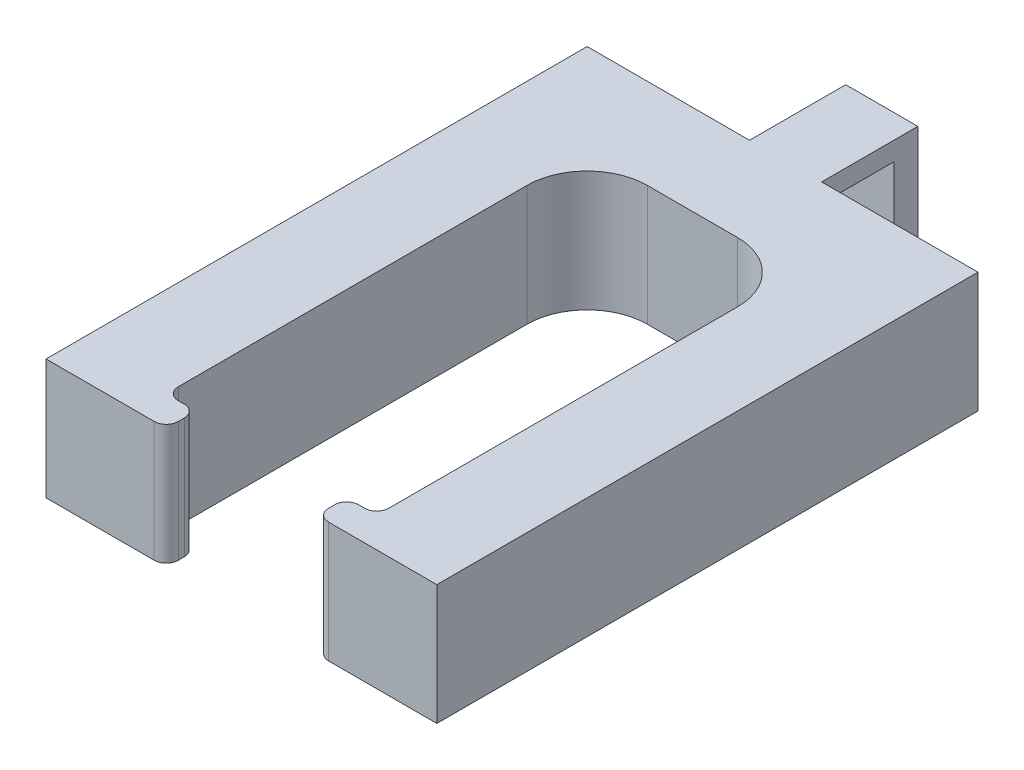
ISO-10303-21;
HEADER;
FILE_DESCRIPTION(('STEP AP214'),'2;1');
FILE_NAME('part.step','',(''),(''),'','','');
FILE_SCHEMA(('AUTOMOTIVE_DESIGN { 1 0 10303 214 1 1 1 1 }'));
ENDSEC;
DATA;
#1=APPLICATION_CONTEXT('core data for automotive mechanical design processes');
#2=APPLICATION_PROTOCOL_DEFINITION('international standard','automotive_design',2000,#1);
#3=PRODUCT_CONTEXT('',#1,'mechanical');
#4=PRODUCT('Part','Part','',(#3));
#5=PRODUCT_RELATED_PRODUCT_CATEGORY('part','',(#4));
#6=PRODUCT_DEFINITION_FORMATION('','',#4);
#7=PRODUCT_DEFINITION_CONTEXT('part definition',#1,'design');
#8=PRODUCT_DEFINITION('design','',#6,#7);
#9=PRODUCT_DEFINITION_SHAPE('','',#8);
#10=(LENGTH_UNIT() NAMED_UNIT(*) SI_UNIT(.MILLI.,.METRE.));
#11=(NAMED_UNIT(*) PLANE_ANGLE_UNIT() SI_UNIT($,.RADIAN.));
#12=(NAMED_UNIT(*) SI_UNIT($,.STERADIAN.) SOLID_ANGLE_UNIT());
#13=UNCERTAINTY_MEASURE_WITH_UNIT(LENGTH_MEASURE(1.E-05),#10,'distance_accuracy_value','');
#14=(GEOMETRIC_REPRESENTATION_CONTEXT(3) GLOBAL_UNCERTAINTY_ASSIGNED_CONTEXT((#13)) GLOBAL_UNIT_ASSIGNED_CONTEXT((#10,
#11,#12)) REPRESENTATION_CONTEXT('',''));
#15=CARTESIAN_POINT('',(0.,0.,0.));
#16=DIRECTION('',(0.,0.,1.));
#17=DIRECTION('',(1.,0.,0.));
#18=AXIS2_PLACEMENT_3D('',#15,#16,#17);
#19=CARTESIAN_POINT('',(0.,20.,0.));
#20=DIRECTION('',(0.,0.,-1.));
#21=DIRECTION('',(-1.,0.,0.));
#22=AXIS2_PLACEMENT_3D('',#19,#20,#21);
#23=PLANE('',#22);
#24=DIRECTION('',(1.,0.,0.));
#25=VECTOR('',#24,1.);
#26=CARTESIAN_POINT('',(0.,0.,0.));
#27=LINE('',#26,#25);
#28=CARTESIAN_POINT('',(0.,0.,0.));
#29=VERTEX_POINT('',#28);
#30=CARTESIAN_POINT('',(18.,0.,0.));
#31=VERTEX_POINT('',#30);
#32=EDGE_CURVE('E220',#29,#31,#27,.T.);
#33=ORIENTED_EDGE('',*,*,#32,.T.);
#34=DIRECTION('',(0.,-1.,0.));
#35=VECTOR('',#34,1.);
#36=CARTESIAN_POINT('',(18.,20.,0.));
#37=LINE('',#36,#35);
#38=CARTESIAN_POINT('',(18.,20.,0.));
#39=VERTEX_POINT('',#38);
#40=EDGE_CURVE('E308',#39,#31,#37,.T.);
#41=ORIENTED_EDGE('',*,*,#40,.F.);
#42=DIRECTION('',(1.,0.,0.));
#43=VECTOR('',#42,1.);
#44=CARTESIAN_POINT('',(0.,20.,0.));
#45=LINE('',#44,#43);
#46=CARTESIAN_POINT('',(0.,20.,0.));
#47=VERTEX_POINT('',#46);
#48=EDGE_CURVE('E260',#47,#39,#45,.T.);
#49=ORIENTED_EDGE('',*,*,#48,.F.);
#50=DIRECTION('',(0.,-1.,0.));
#51=VECTOR('',#50,1.);
#52=CARTESIAN_POINT('',(0.,20.,0.));
#53=LINE('',#52,#51);
#54=EDGE_CURVE('E219',#47,#29,#53,.T.);
#55=ORIENTED_EDGE('',*,*,#54,.T.);
#56=EDGE_LOOP('',(#33,#41,#49,#55));
#57=FACE_BOUND('',#56,.T.);
#58=ADVANCED_FACE('F35',(#57),#23,.F.);
#59=CARTESIAN_POINT('',(18.,20.,-2.));
#60=DIRECTION('',(0.,-1.,0.));
#61=DIRECTION('',(0.,0.,-1.));
#62=AXIS2_PLACEMENT_3D('',#59,#60,#61);
#63=CYLINDRICAL_SURFACE('',#62,2.);
#64=CARTESIAN_POINT('',(18.,0.,-2.));
#65=DIRECTION('',(0.,1.,0.));
#66=DIRECTION('',(0.,0.,1.));
#67=AXIS2_PLACEMENT_3D('',#64,#65,#66);
#68=CIRCLE('',#67,2.);
#69=CARTESIAN_POINT('',(20.,0.,-2.00000000000001));
#70=VERTEX_POINT('',#69);
#71=EDGE_CURVE('E223',#31,#70,#68,.T.);
#72=ORIENTED_EDGE('',*,*,#71,.T.);
#73=DIRECTION('',(0.,-1.,0.));
#74=VECTOR('',#73,1.);
#75=CARTESIAN_POINT('',(20.,20.,-2.00000000000001));
#76=LINE('',#75,#74);
#77=CARTESIAN_POINT('',(20.,20.,-2.00000000000001));
#78=VERTEX_POINT('',#77);
#79=EDGE_CURVE('E305',#78,#70,#76,.T.);
#80=ORIENTED_EDGE('',*,*,#79,.F.);
#81=CARTESIAN_POINT('',(18.,20.,-2.));
#82=DIRECTION('',(0.,1.,0.));
#83=DIRECTION('',(0.,0.,1.));
#84=AXIS2_PLACEMENT_3D('',#81,#82,#83);
#85=CIRCLE('',#84,2.);
#86=EDGE_CURVE('E136',#39,#78,#85,.T.);
#87=ORIENTED_EDGE('',*,*,#86,.F.);
#88=ORIENTED_EDGE('',*,*,#40,.T.);
#89=EDGE_LOOP('',(#72,#80,#87,#88));
#90=FACE_BOUND('',#89,.T.);
#91=ADVANCED_FACE('F392',(#90),#63,.T.);
#92=CARTESIAN_POINT('',(20.,20.,-2.00000000000001));
#93=DIRECTION('',(-1.,0.,0.));
#94=DIRECTION('',(0.,0.,1.));
#95=AXIS2_PLACEMENT_3D('',#92,#93,#94);
#96=PLANE('',#95);
#97=DIRECTION('',(0.,0.,-1.));
#98=VECTOR('',#97,1.);
#99=CARTESIAN_POINT('',(20.,0.,-2.00000000000001));
#100=LINE('',#99,#98);
#101=CARTESIAN_POINT('',(20.,0.,-2.99999999999999));
#102=VERTEX_POINT('',#101);
#103=EDGE_CURVE('E226',#70,#102,#100,.T.);
#104=ORIENTED_EDGE('',*,*,#103,.T.);
#105=DIRECTION('',(0.,-1.,0.));
#106=VECTOR('',#105,1.);
#107=CARTESIAN_POINT('',(20.,20.,-2.99999999999999));
#108=LINE('',#107,#106);
#109=CARTESIAN_POINT('',(20.,20.,-2.99999999999999));
#110=VERTEX_POINT('',#109);
#111=EDGE_CURVE('E302',#110,#102,#108,.T.);
#112=ORIENTED_EDGE('',*,*,#111,.F.);
#113=DIRECTION('',(0.,0.,-1.));
#114=VECTOR('',#113,1.);
#115=CARTESIAN_POINT('',(20.,20.,-2.00000000000001));
#116=LINE('',#115,#114);
#117=EDGE_CURVE('E343',#78,#110,#116,.T.);
#118=ORIENTED_EDGE('',*,*,#117,.F.);
#119=ORIENTED_EDGE('',*,*,#79,.T.);
#120=EDGE_LOOP('',(#104,#112,#118,#119));
#121=FACE_BOUND('',#120,.T.);
#122=ADVANCED_FACE('F395',(#121),#96,.F.);
#123=CARTESIAN_POINT('',(18.,20.,-3.));
#124=DIRECTION('',(0.,-1.,0.));
#125=DIRECTION('',(0.,0.,-1.));
#126=AXIS2_PLACEMENT_3D('',#123,#124,#125);
#127=CYLINDRICAL_SURFACE('',#126,2.);
#128=CARTESIAN_POINT('',(18.,0.,-3.));
#129=DIRECTION('',(0.,1.,0.));
#130=DIRECTION('',(0.,0.,1.));
#131=AXIS2_PLACEMENT_3D('',#128,#129,#130);
#132=CIRCLE('',#131,2.);
#133=CARTESIAN_POINT('',(18.,0.,-5.));
#134=VERTEX_POINT('',#133);
#135=EDGE_CURVE('E228',#102,#134,#132,.T.);
#136=ORIENTED_EDGE('',*,*,#135,.T.);
#137=DIRECTION('',(0.,-1.,0.));
#138=VECTOR('',#137,1.);
#139=CARTESIAN_POINT('',(18.,20.,-5.));
#140=LINE('',#139,#138);
#141=CARTESIAN_POINT('',(18.,20.,-5.));
#142=VERTEX_POINT('',#141);
#143=EDGE_CURVE('E299',#142,#134,#140,.T.);
#144=ORIENTED_EDGE('',*,*,#143,.F.);
#145=CARTESIAN_POINT('',(18.,20.,-3.));
#146=DIRECTION('',(0.,1.,0.));
#147=DIRECTION('',(0.,0.,1.));
#148=AXIS2_PLACEMENT_3D('',#145,#146,#147);
#149=CIRCLE('',#148,2.);
#150=EDGE_CURVE('E345',#110,#142,#149,.T.);
#151=ORIENTED_EDGE('',*,*,#150,.F.);
#152=ORIENTED_EDGE('',*,*,#111,.T.);
#153=EDGE_LOOP('',(#136,#144,#151,#152));
#154=FACE_BOUND('',#153,.T.);
#155=ADVANCED_FACE('F400',(#154),#127,.T.);
#156=CARTESIAN_POINT('',(18.,20.,-5.));
#157=DIRECTION('',(0.,0.,1.));
#158=DIRECTION('',(1.,0.,0.));
#159=AXIS2_PLACEMENT_3D('',#156,#157,#158);
#160=PLANE('',#159);
#161=DIRECTION('',(-1.,0.,0.));
#162=VECTOR('',#161,1.);
#163=CARTESIAN_POINT('',(18.,0.,-5.));
#164=LINE('',#163,#162);
#165=CARTESIAN_POINT('',(17.,0.,-5.));
#166=VERTEX_POINT('',#165);
#167=EDGE_CURVE('E230',#134,#166,#164,.T.);
#168=ORIENTED_EDGE('',*,*,#167,.T.);
#169=DIRECTION('',(0.,-1.,0.));
#170=VECTOR('',#169,1.);
#171=CARTESIAN_POINT('',(17.,20.,-5.));
#172=LINE('',#171,#170);
#173=CARTESIAN_POINT('',(17.,20.,-5.));
#174=VERTEX_POINT('',#173);
#175=EDGE_CURVE('E296',#174,#166,#172,.T.);
#176=ORIENTED_EDGE('',*,*,#175,.F.);
#177=DIRECTION('',(-1.,0.,0.));
#178=VECTOR('',#177,1.);
#179=CARTESIAN_POINT('',(18.,20.,-5.));
#180=LINE('',#179,#178);
#181=EDGE_CURVE('E347',#142,#174,#180,.T.);
#182=ORIENTED_EDGE('',*,*,#181,.F.);
#183=ORIENTED_EDGE('',*,*,#143,.T.);
#184=EDGE_LOOP('',(#168,#176,#182,#183));
#185=FACE_BOUND('',#184,.T.);
#186=ADVANCED_FACE('F406',(#185),#160,.F.);
#187=CARTESIAN_POINT('',(17.,20.,-7.));
#188=DIRECTION('',(0.,-1.,0.));
#189=DIRECTION('',(0.,0.,-1.));
#190=AXIS2_PLACEMENT_3D('',#187,#188,#189);
#191=CYLINDRICAL_SURFACE('',#190,2.);
#192=CARTESIAN_POINT('',(17.,0.,-7.));
#193=DIRECTION('',(0.,-1.,0.));
#194=DIRECTION('',(0.,0.,-1.));
#195=AXIS2_PLACEMENT_3D('',#192,#193,#194);
#196=CIRCLE('',#195,2.);
#197=CARTESIAN_POINT('',(15.,0.,-7.00000000000001));
#198=VERTEX_POINT('',#197);
#199=EDGE_CURVE('E232',#166,#198,#196,.T.);
#200=ORIENTED_EDGE('',*,*,#199,.T.);
#201=DIRECTION('',(0.,-1.,0.));
#202=VECTOR('',#201,1.);
#203=CARTESIAN_POINT('',(15.,20.,-7.00000000000001));
#204=LINE('',#203,#202);
#205=CARTESIAN_POINT('',(15.,20.,-7.00000000000001));
#206=VERTEX_POINT('',#205);
#207=EDGE_CURVE('E293',#206,#198,#204,.T.);
#208=ORIENTED_EDGE('',*,*,#207,.F.);
#209=CARTESIAN_POINT('',(17.,20.,-7.));
#210=DIRECTION('',(0.,-1.,0.));
#211=DIRECTION('',(0.,0.,-1.));
#212=AXIS2_PLACEMENT_3D('',#209,#210,#211);
#213=CIRCLE('',#212,2.);
#214=EDGE_CURVE('E349',#174,#206,#213,.T.);
#215=ORIENTED_EDGE('',*,*,#214,.F.);
#216=ORIENTED_EDGE('',*,*,#175,.T.);
#217=EDGE_LOOP('',(#200,#208,#215,#216));
#218=FACE_BOUND('',#217,.T.);
#219=ADVANCED_FACE('F410',(#218),#191,.F.);
#220=CARTESIAN_POINT('',(15.,20.,-7.00000000000001));
#221=DIRECTION('',(-1.,0.,0.));
#222=DIRECTION('',(0.,0.,1.));
#223=AXIS2_PLACEMENT_3D('',#220,#221,#222);
#224=PLANE('',#223);
#225=DIRECTION('',(0.,0.,-1.));
#226=VECTOR('',#225,1.);
#227=CARTESIAN_POINT('',(15.,0.,-7.00000000000001));
#228=LINE('',#227,#226);
#229=CARTESIAN_POINT('',(15.,0.,-64.9999999999999));
#230=VERTEX_POINT('',#229);
#231=EDGE_CURVE('E234',#198,#230,#228,.T.);
#232=ORIENTED_EDGE('',*,*,#231,.T.);
#233=DIRECTION('',(0.,-1.,0.));
#234=VECTOR('',#233,1.);
#235=CARTESIAN_POINT('',(15.,20.,-64.9999999999999));
#236=LINE('',#235,#234);
#237=CARTESIAN_POINT('',(15.,20.,-64.9999999999999));
#238=VERTEX_POINT('',#237);
#239=EDGE_CURVE('E290',#238,#230,#236,.T.);
#240=ORIENTED_EDGE('',*,*,#239,.F.);
#241=DIRECTION('',(0.,0.,-1.));
#242=VECTOR('',#241,1.);
#243=CARTESIAN_POINT('',(15.,20.,-7.00000000000001));
#244=LINE('',#243,#242);
#245=EDGE_CURVE('E351',#206,#238,#244,.T.);
#246=ORIENTED_EDGE('',*,*,#245,.F.);
#247=ORIENTED_EDGE('',*,*,#207,.T.);
#248=EDGE_LOOP('',(#232,#240,#246,#247));
#249=FACE_BOUND('',#248,.T.);
#250=ADVANCED_FACE('F415',(#249),#224,.F.);
#251=CARTESIAN_POINT('',(25.,20.,-65.));
#252=DIRECTION('',(0.,-1.,0.));
#253=DIRECTION('',(0.,0.,-1.));
#254=AXIS2_PLACEMENT_3D('',#251,#252,#253);
#255=CYLINDRICAL_SURFACE('',#254,10.);
#256=CARTESIAN_POINT('',(25.,0.,-65.));
#257=DIRECTION('',(0.,-1.,0.));
#258=DIRECTION('',(0.,0.,-1.));
#259=AXIS2_PLACEMENT_3D('',#256,#257,#258);
#260=CIRCLE('',#259,10.);
#261=CARTESIAN_POINT('',(25.0000000000001,0.,-75.));
#262=VERTEX_POINT('',#261);
#263=EDGE_CURVE('E236',#230,#262,#260,.T.);
#264=ORIENTED_EDGE('',*,*,#263,.T.);
#265=DIRECTION('',(0.,-1.,0.));
#266=VECTOR('',#265,1.);
#267=CARTESIAN_POINT('',(25.0000000000001,20.,-75.));
#268=LINE('',#267,#266);
#269=CARTESIAN_POINT('',(25.0000000000001,20.,-75.));
#270=VERTEX_POINT('',#269);
#271=EDGE_CURVE('E287',#270,#262,#268,.T.);
#272=ORIENTED_EDGE('',*,*,#271,.F.);
#273=CARTESIAN_POINT('',(25.,20.,-65.));
#274=DIRECTION('',(0.,-1.,0.));
#275=DIRECTION('',(0.,0.,-1.));
#276=AXIS2_PLACEMENT_3D('',#273,#274,#275);
#277=CIRCLE('',#276,10.);
#278=EDGE_CURVE('E353',#238,#270,#277,.T.);
#279=ORIENTED_EDGE('',*,*,#278,.F.);
#280=ORIENTED_EDGE('',*,*,#239,.T.);
#281=EDGE_LOOP('',(#264,#272,#279,#280));
#282=FACE_BOUND('',#281,.T.);
#283=ADVANCED_FACE('F421',(#282),#255,.F.);
#284=CARTESIAN_POINT('',(25.0000000000001,20.,-75.));
#285=DIRECTION('',(0.,0.,-1.));
#286=DIRECTION('',(-1.,0.,0.));
#287=AXIS2_PLACEMENT_3D('',#284,#285,#286);
#288=PLANE('',#287);
#289=DIRECTION('',(1.,0.,0.));
#290=VECTOR('',#289,1.);
#291=CARTESIAN_POINT('',(25.0000000000001,0.,-75.));
#292=LINE('',#291,#290);
#293=CARTESIAN_POINT('',(39.9999999999999,0.,-75.));
#294=VERTEX_POINT('',#293);
#295=EDGE_CURVE('E238',#262,#294,#292,.T.);
#296=ORIENTED_EDGE('',*,*,#295,.T.);
#297=DIRECTION('',(0.,-1.,0.));
#298=VECTOR('',#297,1.);
#299=CARTESIAN_POINT('',(39.9999999999999,20.,-75.));
#300=LINE('',#299,#298);
#301=CARTESIAN_POINT('',(39.9999999999999,20.,-75.));
#302=VERTEX_POINT('',#301);
#303=EDGE_CURVE('E284',#302,#294,#300,.T.);
#304=ORIENTED_EDGE('',*,*,#303,.F.);
#305=DIRECTION('',(1.,0.,0.));
#306=VECTOR('',#305,1.);
#307=CARTESIAN_POINT('',(25.0000000000001,20.,-75.));
#308=LINE('',#307,#306);
#309=EDGE_CURVE('E355',#270,#302,#308,.T.);
#310=ORIENTED_EDGE('',*,*,#309,.F.);
#311=ORIENTED_EDGE('',*,*,#271,.T.);
#312=EDGE_LOOP('',(#296,#304,#310,#311));
#313=FACE_BOUND('',#312,.T.);
#314=ADVANCED_FACE('F425',(#313),#288,.F.);
#315=CARTESIAN_POINT('',(40.,20.,-65.));
#316=DIRECTION('',(0.,-1.,0.));
#317=DIRECTION('',(0.,0.,-1.));
#318=AXIS2_PLACEMENT_3D('',#315,#316,#317);
#319=CYLINDRICAL_SURFACE('',#318,9.99999999999999);
#320=CARTESIAN_POINT('',(40.,0.,-65.));
#321=DIRECTION('',(0.,-1.,0.));
#322=DIRECTION('',(0.,0.,-1.));
#323=AXIS2_PLACEMENT_3D('',#320,#321,#322);
#324=CIRCLE('',#323,9.99999999999999);
#325=CARTESIAN_POINT('',(50.,0.,-64.9999999999999));
#326=VERTEX_POINT('',#325);
#327=EDGE_CURVE('E240',#294,#326,#324,.T.);
#328=ORIENTED_EDGE('',*,*,#327,.T.);
#329=DIRECTION('',(0.,-1.,0.));
#330=VECTOR('',#329,1.);
#331=CARTESIAN_POINT('',(50.,20.,-64.9999999999999));
#332=LINE('',#331,#330);
#333=CARTESIAN_POINT('',(50.,20.,-64.9999999999999));
#334=VERTEX_POINT('',#333);
#335=EDGE_CURVE('E281',#334,#326,#332,.T.);
#336=ORIENTED_EDGE('',*,*,#335,.F.);
#337=CARTESIAN_POINT('',(40.,20.,-65.));
#338=DIRECTION('',(0.,-1.,0.));
#339=DIRECTION('',(0.,0.,-1.));
#340=AXIS2_PLACEMENT_3D('',#337,#338,#339);
#341=CIRCLE('',#340,9.99999999999999);
#342=EDGE_CURVE('E357',#302,#334,#341,.T.);
#343=ORIENTED_EDGE('',*,*,#342,.F.);
#344=ORIENTED_EDGE('',*,*,#303,.T.);
#345=EDGE_LOOP('',(#328,#336,#343,#344));
#346=FACE_BOUND('',#345,.T.);
#347=ADVANCED_FACE('F430',(#346),#319,.F.);
#348=CARTESIAN_POINT('',(50.,20.,-64.9999999999999));
#349=DIRECTION('',(1.,0.,0.));
#350=DIRECTION('',(0.,0.,-1.));
#351=AXIS2_PLACEMENT_3D('',#348,#349,#350);
#352=PLANE('',#351);
#353=DIRECTION('',(0.,0.,1.));
#354=VECTOR('',#353,1.);
#355=CARTESIAN_POINT('',(50.,0.,-64.9999999999999));
#356=LINE('',#355,#354);
#357=CARTESIAN_POINT('',(50.,0.,-7.00000000000002));
#358=VERTEX_POINT('',#357);
#359=EDGE_CURVE('E242',#326,#358,#356,.T.);
#360=ORIENTED_EDGE('',*,*,#359,.T.);
#361=DIRECTION('',(0.,-1.,0.));
#362=VECTOR('',#361,1.);
#363=CARTESIAN_POINT('',(50.,20.,-7.00000000000002));
#364=LINE('',#363,#362);
#365=CARTESIAN_POINT('',(50.,20.,-7.00000000000002));
#366=VERTEX_POINT('',#365);
#367=EDGE_CURVE('E278',#366,#358,#364,.T.);
#368=ORIENTED_EDGE('',*,*,#367,.F.);
#369=DIRECTION('',(0.,0.,1.));
#370=VECTOR('',#369,1.);
#371=CARTESIAN_POINT('',(50.,20.,-64.9999999999999));
#372=LINE('',#371,#370);
#373=EDGE_CURVE('E359',#334,#366,#372,.T.);
#374=ORIENTED_EDGE('',*,*,#373,.F.);
#375=ORIENTED_EDGE('',*,*,#335,.T.);
#376=EDGE_LOOP('',(#360,#368,#374,#375));
#377=FACE_BOUND('',#376,.T.);
#378=ADVANCED_FACE('F436',(#377),#352,.F.);
#379=CARTESIAN_POINT('',(48.,20.,-7.));
#380=DIRECTION('',(0.,-1.,0.));
#381=DIRECTION('',(0.,0.,-1.));
#382=AXIS2_PLACEMENT_3D('',#379,#380,#381);
#383=CYLINDRICAL_SURFACE('',#382,2.);
#384=CARTESIAN_POINT('',(48.,0.,-7.));
#385=DIRECTION('',(0.,-1.,0.));
#386=DIRECTION('',(0.,0.,-1.));
#387=AXIS2_PLACEMENT_3D('',#384,#385,#386);
#388=CIRCLE('',#387,2.);
#389=CARTESIAN_POINT('',(48.,0.,-5.));
#390=VERTEX_POINT('',#389);
#391=EDGE_CURVE('E244',#358,#390,#388,.T.);
#392=ORIENTED_EDGE('',*,*,#391,.T.);
#393=DIRECTION('',(0.,-1.,0.));
#394=VECTOR('',#393,1.);
#395=CARTESIAN_POINT('',(48.,20.,-5.));
#396=LINE('',#395,#394);
#397=CARTESIAN_POINT('',(48.,20.,-5.));
#398=VERTEX_POINT('',#397);
#399=EDGE_CURVE('E275',#398,#390,#396,.T.);
#400=ORIENTED_EDGE('',*,*,#399,.F.);
#401=CARTESIAN_POINT('',(48.,20.,-7.));
#402=DIRECTION('',(0.,-1.,0.));
#403=DIRECTION('',(0.,0.,-1.));
#404=AXIS2_PLACEMENT_3D('',#401,#402,#403);
#405=CIRCLE('',#404,2.);
#406=EDGE_CURVE('E361',#366,#398,#405,.T.);
#407=ORIENTED_EDGE('',*,*,#406,.F.);
#408=ORIENTED_EDGE('',*,*,#367,.T.);
#409=EDGE_LOOP('',(#392,#400,#407,#408));
#410=FACE_BOUND('',#409,.T.);
#411=ADVANCED_FACE('F440',(#410),#383,.F.);
#412=CARTESIAN_POINT('',(48.,20.,-5.));
#413=DIRECTION('',(0.,0.,1.));
#414=DIRECTION('',(1.,0.,0.));
#415=AXIS2_PLACEMENT_3D('',#412,#413,#414);
#416=PLANE('',#415);
#417=DIRECTION('',(-1.,0.,0.));
#418=VECTOR('',#417,1.);
#419=CARTESIAN_POINT('',(48.,0.,-5.));
#420=LINE('',#419,#418);
#421=CARTESIAN_POINT('',(47.,0.,-5.));
#422=VERTEX_POINT('',#421);
#423=EDGE_CURVE('E246',#390,#422,#420,.T.);
#424=ORIENTED_EDGE('',*,*,#423,.T.);
#425=DIRECTION('',(0.,-1.,0.));
#426=VECTOR('',#425,1.);
#427=CARTESIAN_POINT('',(47.,20.,-5.));
#428=LINE('',#427,#426);
#429=CARTESIAN_POINT('',(47.,20.,-5.));
#430=VERTEX_POINT('',#429);
#431=EDGE_CURVE('E272',#430,#422,#428,.T.);
#432=ORIENTED_EDGE('',*,*,#431,.F.);
#433=DIRECTION('',(-1.,0.,0.));
#434=VECTOR('',#433,1.);
#435=CARTESIAN_POINT('',(48.,20.,-5.));
#436=LINE('',#435,#434);
#437=EDGE_CURVE('E363',#398,#430,#436,.T.);
#438=ORIENTED_EDGE('',*,*,#437,.F.);
#439=ORIENTED_EDGE('',*,*,#399,.T.);
#440=EDGE_LOOP('',(#424,#432,#438,#439));
#441=FACE_BOUND('',#440,.T.);
#442=ADVANCED_FACE('F445',(#441),#416,.F.);
#443=CARTESIAN_POINT('',(47.,20.,-3.));
#444=DIRECTION('',(0.,-1.,0.));
#445=DIRECTION('',(0.,0.,-1.));
#446=AXIS2_PLACEMENT_3D('',#443,#444,#445);
#447=CYLINDRICAL_SURFACE('',#446,2.);
#448=CARTESIAN_POINT('',(47.,0.,-3.));
#449=DIRECTION('',(0.,1.,0.));
#450=DIRECTION('',(0.,0.,1.));
#451=AXIS2_PLACEMENT_3D('',#448,#449,#450);
#452=CIRCLE('',#451,2.);
#453=CARTESIAN_POINT('',(45.,0.,-2.99999999999999));
#454=VERTEX_POINT('',#453);
#455=EDGE_CURVE('E248',#422,#454,#452,.T.);
#456=ORIENTED_EDGE('',*,*,#455,.T.);
#457=DIRECTION('',(0.,-1.,0.));
#458=VECTOR('',#457,1.);
#459=CARTESIAN_POINT('',(45.,20.,-2.99999999999999));
#460=LINE('',#459,#458);
#461=CARTESIAN_POINT('',(45.,20.,-2.99999999999999));
#462=VERTEX_POINT('',#461);
#463=EDGE_CURVE('E269',#462,#454,#460,.T.);
#464=ORIENTED_EDGE('',*,*,#463,.F.);
#465=CARTESIAN_POINT('',(47.,20.,-3.));
#466=DIRECTION('',(0.,1.,0.));
#467=DIRECTION('',(0.,0.,1.));
#468=AXIS2_PLACEMENT_3D('',#465,#466,#467);
#469=CIRCLE('',#468,2.);
#470=EDGE_CURVE('E365',#430,#462,#469,.T.);
#471=ORIENTED_EDGE('',*,*,#470,.F.);
#472=ORIENTED_EDGE('',*,*,#431,.T.);
#473=EDGE_LOOP('',(#456,#464,#471,#472));
#474=FACE_BOUND('',#473,.T.);
#475=ADVANCED_FACE('F448',(#474),#447,.T.);
#476=CARTESIAN_POINT('',(45.,20.,-2.99999999999999));
#477=DIRECTION('',(1.,0.,0.));
#478=DIRECTION('',(0.,0.,-1.));
#479=AXIS2_PLACEMENT_3D('',#476,#477,#478);
#480=PLANE('',#479);
#481=DIRECTION('',(0.,0.,1.));
#482=VECTOR('',#481,1.);
#483=CARTESIAN_POINT('',(45.,0.,-2.99999999999999));
#484=LINE('',#483,#482);
#485=CARTESIAN_POINT('',(45.,0.,-2.00000000000001));
#486=VERTEX_POINT('',#485);
#487=EDGE_CURVE('E250',#454,#486,#484,.T.);
#488=ORIENTED_EDGE('',*,*,#487,.T.);
#489=DIRECTION('',(0.,-1.,0.));
#490=VECTOR('',#489,1.);
#491=CARTESIAN_POINT('',(45.,20.,-2.00000000000001));
#492=LINE('',#491,#490);
#493=CARTESIAN_POINT('',(45.,20.,-2.00000000000001));
#494=VERTEX_POINT('',#493);
#495=EDGE_CURVE('E266',#494,#486,#492,.T.);
#496=ORIENTED_EDGE('',*,*,#495,.F.);
#497=DIRECTION('',(0.,0.,1.));
#498=VECTOR('',#497,1.);
#499=CARTESIAN_POINT('',(45.,20.,-2.99999999999999));
#500=LINE('',#499,#498);
#501=EDGE_CURVE('E367',#462,#494,#500,.T.);
#502=ORIENTED_EDGE('',*,*,#501,.F.);
#503=ORIENTED_EDGE('',*,*,#463,.T.);
#504=EDGE_LOOP('',(#488,#496,#502,#503));
#505=FACE_BOUND('',#504,.T.);
#506=ADVANCED_FACE('F373',(#505),#480,.F.);
#507=CARTESIAN_POINT('',(47.,20.,-2.));
#508=DIRECTION('',(0.,-1.,0.));
#509=DIRECTION('',(0.,0.,-1.));
#510=AXIS2_PLACEMENT_3D('',#507,#508,#509);
#511=CYLINDRICAL_SURFACE('',#510,2.);
#512=CARTESIAN_POINT('',(47.,0.,-2.));
#513=DIRECTION('',(0.,1.,0.));
#514=DIRECTION('',(0.,0.,1.));
#515=AXIS2_PLACEMENT_3D('',#512,#513,#514);
#516=CIRCLE('',#515,2.);
#517=CARTESIAN_POINT('',(47.,0.,0.));
#518=VERTEX_POINT('',#517);
#519=EDGE_CURVE('E252',#486,#518,#516,.T.);
#520=ORIENTED_EDGE('',*,*,#519,.T.);
#521=DIRECTION('',(0.,-1.,0.));
#522=VECTOR('',#521,1.);
#523=CARTESIAN_POINT('',(47.,20.,0.));
#524=LINE('',#523,#522);
#525=CARTESIAN_POINT('',(47.,20.,0.));
#526=VERTEX_POINT('',#525);
#527=EDGE_CURVE('E207',#526,#518,#524,.T.);
#528=ORIENTED_EDGE('',*,*,#527,.F.);
#529=CARTESIAN_POINT('',(47.,20.,-2.));
#530=DIRECTION('',(0.,1.,0.));
#531=DIRECTION('',(0.,0.,1.));
#532=AXIS2_PLACEMENT_3D('',#529,#530,#531);
#533=CIRCLE('',#532,2.);
#534=EDGE_CURVE('E194',#494,#526,#533,.T.);
#535=ORIENTED_EDGE('',*,*,#534,.F.);
#536=ORIENTED_EDGE('',*,*,#495,.T.);
#537=EDGE_LOOP('',(#520,#528,#535,#536));
#538=FACE_BOUND('',#537,.T.);
#539=ADVANCED_FACE('F377',(#538),#511,.T.);
#540=CARTESIAN_POINT('',(47.,20.,0.));
#541=DIRECTION('',(0.,0.,-1.));
#542=DIRECTION('',(-1.,0.,0.));
#543=AXIS2_PLACEMENT_3D('',#540,#541,#542);
#544=PLANE('',#543);
#545=DIRECTION('',(1.,0.,0.));
#546=VECTOR('',#545,1.);
#547=CARTESIAN_POINT('',(47.,0.,0.));
#548=LINE('',#547,#546);
#549=CARTESIAN_POINT('',(65.,0.,0.));
#550=VERTEX_POINT('',#549);
#551=EDGE_CURVE('E203',#518,#550,#548,.T.);
#552=ORIENTED_EDGE('',*,*,#551,.T.);
#553=DIRECTION('',(0.,-1.,0.));
#554=VECTOR('',#553,1.);
#555=CARTESIAN_POINT('',(65.,20.,0.));
#556=LINE('',#555,#554);
#557=CARTESIAN_POINT('',(65.,20.,0.));
#558=VERTEX_POINT('',#557);
#559=EDGE_CURVE('E200',#558,#550,#556,.T.);
#560=ORIENTED_EDGE('',*,*,#559,.F.);
#561=DIRECTION('',(1.,0.,0.));
#562=VECTOR('',#561,1.);
#563=CARTESIAN_POINT('',(47.,20.,0.));
#564=LINE('',#563,#562);
#565=EDGE_CURVE('E185',#526,#558,#564,.T.);
#566=ORIENTED_EDGE('',*,*,#565,.F.);
#567=ORIENTED_EDGE('',*,*,#527,.T.);
#568=EDGE_LOOP('',(#552,#560,#566,#567));
#569=FACE_BOUND('',#568,.T.);
#570=ADVANCED_FACE('F201',(#569),#544,.F.);
#571=CARTESIAN_POINT('',(65.,20.,-90.));
#572=DIRECTION('',(-1.,0.,0.));
#573=DIRECTION('',(0.,0.,1.));
#574=AXIS2_PLACEMENT_3D('',#571,#572,#573);
#575=PLANE('',#574);
#576=DIRECTION('',(0.,-1.,0.));
#577=VECTOR('',#576,1.);
#578=CARTESIAN_POINT('',(65.,20.,-90.));
#579=LINE('',#578,#577);
#580=CARTESIAN_POINT('',(65.,20.,-90.));
#581=VERTEX_POINT('',#580);
#582=CARTESIAN_POINT('',(65.,0.,-90.));
#583=VERTEX_POINT('',#582);
#584=EDGE_CURVE('E208',#581,#583,#579,.T.);
#585=ORIENTED_EDGE('',*,*,#584,.F.);
#586=DIRECTION('',(0.,0.,-1.));
#587=VECTOR('',#586,1.);
#588=CARTESIAN_POINT('',(65.,20.,-90.));
#589=LINE('',#588,#587);
#590=EDGE_CURVE('E192',#558,#581,#589,.T.);
#591=ORIENTED_EDGE('',*,*,#590,.F.);
#592=ORIENTED_EDGE('',*,*,#559,.T.);
#593=DIRECTION('',(0.,0.,-1.));
#594=VECTOR('',#593,1.);
#595=CARTESIAN_POINT('',(65.,0.,-90.));
#596=LINE('',#595,#594);
#597=EDGE_CURVE('E255',#550,#583,#596,.T.);
#598=ORIENTED_EDGE('',*,*,#597,.T.);
#599=EDGE_LOOP('',(#585,#591,#592,#598));
#600=FACE_BOUND('',#599,.T.);
#601=ADVANCED_FACE('F211',(#600),#575,.F.);
#602=CARTESIAN_POINT('',(0.,20.,-90.));
#603=DIRECTION('',(0.,0.,1.));
#604=DIRECTION('',(1.,0.,0.));
#605=AXIS2_PLACEMENT_3D('',#602,#603,#604);
#606=PLANE('',#605);
#607=DIRECTION('',(-1.,0.,0.));
#608=VECTOR('',#607,1.);
#609=CARTESIAN_POINT('',(0.,0.,-90.));
#610=LINE('',#609,#608);
#611=CARTESIAN_POINT('',(0.,0.,-90.));
#612=VERTEX_POINT('',#611);
#613=EDGE_CURVE('E257',#583,#612,#610,.T.);
#614=ORIENTED_EDGE('',*,*,#613,.T.);
#615=DIRECTION('',(0.,-1.,0.));
#616=VECTOR('',#615,1.);
#617=CARTESIAN_POINT('',(0.,20.,-90.));
#618=LINE('',#617,#616);
#619=CARTESIAN_POINT('',(0.,20.,-90.));
#620=VERTEX_POINT('',#619);
#621=EDGE_CURVE('E262',#620,#612,#618,.T.);
#622=ORIENTED_EDGE('',*,*,#621,.F.);
#623=DIRECTION('',(-1.,0.,0.));
#624=VECTOR('',#623,1.);
#625=CARTESIAN_POINT('',(0.,20.,-90.));
#626=LINE('',#625,#624);
#627=CARTESIAN_POINT('',(27.,20.,-90.));
#628=VERTEX_POINT('',#627);
#629=EDGE_CURVE('E213',#628,#620,#626,.T.);
#630=ORIENTED_EDGE('',*,*,#629,.F.);
#631=DIRECTION('',(0.,1.,0.));
#632=VECTOR('',#631,1.);
#633=CARTESIAN_POINT('',(27.,-44.,-90.));
#634=LINE('',#633,#632);
#635=CARTESIAN_POINT('',(27.,16.8987714255567,-90.));
#636=VERTEX_POINT('',#635);
#637=EDGE_CURVE('E629',#636,#628,#634,.T.);
#638=ORIENTED_EDGE('',*,*,#637,.F.);
#639=DIRECTION('',(1.,0.,0.));
#640=VECTOR('',#639,1.);
#641=CARTESIAN_POINT('',(0.999999999999973,16.8987714255567,-90.));
#642=LINE('',#641,#640);
#643=CARTESIAN_POINT('',(39.,16.8987714255567,-90.));
#644=VERTEX_POINT('',#643);
#645=EDGE_CURVE('E331',#636,#644,#642,.T.);
#646=ORIENTED_EDGE('',*,*,#645,.T.);
#647=DIRECTION('',(0.,1.,0.));
#648=VECTOR('',#647,1.);
#649=CARTESIAN_POINT('',(39.,-44.,-90.));
#650=LINE('',#649,#648);
#651=CARTESIAN_POINT('',(39.,20.,-90.));
#652=VERTEX_POINT('',#651);
#653=EDGE_CURVE('E327',#644,#652,#650,.T.);
#654=ORIENTED_EDGE('',*,*,#653,.T.);
#655=DIRECTION('',(1.,0.,0.));
#656=VECTOR('',#655,1.);
#657=CARTESIAN_POINT('',(39.,20.,-90.));
#658=LINE('',#657,#656);
#659=EDGE_CURVE('E326',#652,#581,#658,.T.);
#660=ORIENTED_EDGE('',*,*,#659,.T.);
#661=ORIENTED_EDGE('',*,*,#584,.T.);
#662=EDGE_LOOP('',(#614,#622,#630,#638,#646,#654,#660,#661));
#663=FACE_BOUND('',#662,.T.);
#664=ADVANCED_FACE('F384',(#663),#606,.F.);
#665=CARTESIAN_POINT('',(0.,20.,0.));
#666=DIRECTION('',(1.,0.,0.));
#667=DIRECTION('',(0.,0.,-1.));
#668=AXIS2_PLACEMENT_3D('',#665,#666,#667);
#669=PLANE('',#668);
#670=DIRECTION('',(0.,0.,1.));
#671=VECTOR('',#670,1.);
#672=CARTESIAN_POINT('',(0.,0.,0.));
#673=LINE('',#672,#671);
#674=EDGE_CURVE('E127',#612,#29,#673,.T.);
#675=ORIENTED_EDGE('',*,*,#674,.T.);
#676=ORIENTED_EDGE('',*,*,#54,.F.);
#677=DIRECTION('',(0.,0.,1.));
#678=VECTOR('',#677,1.);
#679=CARTESIAN_POINT('',(0.,20.,0.));
#680=LINE('',#679,#678);
#681=EDGE_CURVE('E58',#620,#47,#680,.T.);
#682=ORIENTED_EDGE('',*,*,#681,.F.);
#683=ORIENTED_EDGE('',*,*,#621,.T.);
#684=EDGE_LOOP('',(#675,#676,#682,#683));
#685=FACE_BOUND('',#684,.T.);
#686=ADVANCED_FACE('F386',(#685),#669,.F.);
#687=CARTESIAN_POINT('',(18.,20.,-2.));
#688=DIRECTION('',(0.,1.,0.));
#689=DIRECTION('',(0.,0.,1.));
#690=AXIS2_PLACEMENT_3D('',#687,#688,#689);
#691=PLANE('',#690);
#692=DIRECTION('',(0.,0.,-1.));
#693=VECTOR('',#692,1.);
#694=CARTESIAN_POINT('',(27.,20.,-109.944844374917));
#695=LINE('',#694,#693);
#696=CARTESIAN_POINT('',(27.,20.,-106.));
#697=VERTEX_POINT('',#696);
#698=EDGE_CURVE('E639',#628,#697,#695,.T.);
#699=ORIENTED_EDGE('',*,*,#698,.F.);
#700=ORIENTED_EDGE('',*,*,#629,.T.);
#701=ORIENTED_EDGE('',*,*,#681,.T.);
#702=ORIENTED_EDGE('',*,*,#48,.T.);
#703=ORIENTED_EDGE('',*,*,#86,.T.);
#704=ORIENTED_EDGE('',*,*,#117,.T.);
#705=ORIENTED_EDGE('',*,*,#150,.T.);
#706=ORIENTED_EDGE('',*,*,#181,.T.);
#707=ORIENTED_EDGE('',*,*,#214,.T.);
#708=ORIENTED_EDGE('',*,*,#245,.T.);
#709=ORIENTED_EDGE('',*,*,#278,.T.);
#710=ORIENTED_EDGE('',*,*,#309,.T.);
#711=ORIENTED_EDGE('',*,*,#342,.T.);
#712=ORIENTED_EDGE('',*,*,#373,.T.);
#713=ORIENTED_EDGE('',*,*,#406,.T.);
#714=ORIENTED_EDGE('',*,*,#437,.T.);
#715=ORIENTED_EDGE('',*,*,#470,.T.);
#716=ORIENTED_EDGE('',*,*,#501,.T.);
#717=ORIENTED_EDGE('',*,*,#534,.T.);
#718=ORIENTED_EDGE('',*,*,#565,.T.);
#719=ORIENTED_EDGE('',*,*,#590,.T.);
#720=ORIENTED_EDGE('',*,*,#659,.F.);
#721=DIRECTION('',(0.,0.,1.));
#722=VECTOR('',#721,1.);
#723=CARTESIAN_POINT('',(39.,20.,-90.));
#724=LINE('',#723,#722);
#725=CARTESIAN_POINT('',(39.,20.,-106.));
#726=VERTEX_POINT('',#725);
#727=EDGE_CURVE('E316',#726,#652,#724,.T.);
#728=ORIENTED_EDGE('',*,*,#727,.F.);
#729=DIRECTION('',(1.,0.,0.));
#730=VECTOR('',#729,1.);
#731=CARTESIAN_POINT('',(0.999999999999959,20.,-106.));
#732=LINE('',#731,#730);
#733=EDGE_CURVE('E325',#697,#726,#732,.T.);
#734=ORIENTED_EDGE('',*,*,#733,.F.);
#735=EDGE_LOOP('',(#699,#700,#701,#702,#703,#704,#705,#706,#707,#708,#709,#710,#711,#712,#713,
#714,#715,#716,#717,#718,#719,#720,#728,#734));
#736=FACE_BOUND('',#735,.T.);
#737=ADVANCED_FACE('F188',(#736),#691,.T.);
#738=CARTESIAN_POINT('',(18.,0.,-2.));
#739=DIRECTION('',(0.,1.,0.));
#740=DIRECTION('',(0.,0.,1.));
#741=AXIS2_PLACEMENT_3D('',#738,#739,#740);
#742=PLANE('',#741);
#743=ORIENTED_EDGE('',*,*,#32,.F.);
#744=ORIENTED_EDGE('',*,*,#674,.F.);
#745=ORIENTED_EDGE('',*,*,#613,.F.);
#746=ORIENTED_EDGE('',*,*,#597,.F.);
#747=ORIENTED_EDGE('',*,*,#551,.F.);
#748=ORIENTED_EDGE('',*,*,#519,.F.);
#749=ORIENTED_EDGE('',*,*,#487,.F.);
#750=ORIENTED_EDGE('',*,*,#455,.F.);
#751=ORIENTED_EDGE('',*,*,#423,.F.);
#752=ORIENTED_EDGE('',*,*,#391,.F.);
#753=ORIENTED_EDGE('',*,*,#359,.F.);
#754=ORIENTED_EDGE('',*,*,#327,.F.);
#755=ORIENTED_EDGE('',*,*,#295,.F.);
#756=ORIENTED_EDGE('',*,*,#263,.F.);
#757=ORIENTED_EDGE('',*,*,#231,.F.);
#758=ORIENTED_EDGE('',*,*,#199,.F.);
#759=ORIENTED_EDGE('',*,*,#167,.F.);
#760=ORIENTED_EDGE('',*,*,#135,.F.);
#761=ORIENTED_EDGE('',*,*,#103,.F.);
#762=ORIENTED_EDGE('',*,*,#71,.F.);
#763=EDGE_LOOP('',(#743,#744,#745,#746,#747,#748,#749,#750,#751,#752,#753,#754,#755,#756,#757,
#758,#759,#760,#761,#762));
#764=FACE_BOUND('',#763,.T.);
#765=ADVANCED_FACE('F380',(#764),#742,.F.);
#766=CARTESIAN_POINT('',(0.999999999999959,-20.,-106.));
#767=DIRECTION('',(0.,-1.,0.));
#768=DIRECTION('',(0.,0.,-1.));
#769=AXIS2_PLACEMENT_3D('',#766,#767,#768);
#770=PLANE('',#769);
#771=DIRECTION('',(0.,0.,1.));
#772=VECTOR('',#771,1.);
#773=CARTESIAN_POINT('',(27.,-20.,-106.));
#774=LINE('',#773,#772);
#775=CARTESIAN_POINT('',(27.,-20.,-106.));
#776=VERTEX_POINT('',#775);
#777=CARTESIAN_POINT('',(27.,-20.,-102.));
#778=VERTEX_POINT('',#777);
#779=EDGE_CURVE('E647',#776,#778,#774,.T.);
#780=ORIENTED_EDGE('',*,*,#779,.F.);
#781=DIRECTION('',(1.,0.,0.));
#782=VECTOR('',#781,1.);
#783=CARTESIAN_POINT('',(0.999999999999959,-20.,-106.));
#784=LINE('',#783,#782);
#785=CARTESIAN_POINT('',(39.,-20.,-106.));
#786=VERTEX_POINT('',#785);
#787=EDGE_CURVE('E332',#776,#786,#784,.T.);
#788=ORIENTED_EDGE('',*,*,#787,.T.);
#789=DIRECTION('',(0.,0.,-1.));
#790=VECTOR('',#789,1.);
#791=CARTESIAN_POINT('',(39.,-20.,-106.));
#792=LINE('',#791,#790);
#793=CARTESIAN_POINT('',(39.,-20.,-102.));
#794=VERTEX_POINT('',#793);
#795=EDGE_CURVE('E49',#794,#786,#792,.T.);
#796=ORIENTED_EDGE('',*,*,#795,.F.);
#797=DIRECTION('',(1.,0.,0.));
#798=VECTOR('',#797,1.);
#799=CARTESIAN_POINT('',(0.999999999999973,-20.,-102.));
#800=LINE('',#799,#798);
#801=EDGE_CURVE('E224',#778,#794,#800,.T.);
#802=ORIENTED_EDGE('',*,*,#801,.F.);
#803=EDGE_LOOP('',(#780,#788,#796,#802));
#804=FACE_BOUND('',#803,.T.);
#805=ADVANCED_FACE('F564',(#804),#770,.T.);
#806=CARTESIAN_POINT('',(0.999999999999973,-20.,-102.));
#807=DIRECTION('',(0.,0.,1.));
#808=DIRECTION('',(1.,0.,0.));
#809=AXIS2_PLACEMENT_3D('',#806,#807,#808);
#810=PLANE('',#809);
#811=DIRECTION('',(0.,1.,0.));
#812=VECTOR('',#811,1.);
#813=CARTESIAN_POINT('',(27.,-20.,-102.));
#814=LINE('',#813,#812);
#815=CARTESIAN_POINT('',(27.,16.8987714255567,-102.));
#816=VERTEX_POINT('',#815);
#817=EDGE_CURVE('E632',#778,#816,#814,.T.);
#818=ORIENTED_EDGE('',*,*,#817,.F.);
#819=ORIENTED_EDGE('',*,*,#801,.T.);
#820=DIRECTION('',(0.,-1.,0.));
#821=VECTOR('',#820,1.);
#822=CARTESIAN_POINT('',(39.,-20.,-102.));
#823=LINE('',#822,#821);
#824=CARTESIAN_POINT('',(39.,16.8987714255567,-102.));
#825=VERTEX_POINT('',#824);
#826=EDGE_CURVE('E648',#825,#794,#823,.T.);
#827=ORIENTED_EDGE('',*,*,#826,.F.);
#828=DIRECTION('',(1.,0.,0.));
#829=VECTOR('',#828,1.);
#830=CARTESIAN_POINT('',(0.999999999999973,16.8987714255567,-102.));
#831=LINE('',#830,#829);
#832=EDGE_CURVE('E335',#816,#825,#831,.T.);
#833=ORIENTED_EDGE('',*,*,#832,.F.);
#834=EDGE_LOOP('',(#818,#819,#827,#833));
#835=FACE_BOUND('',#834,.T.);
#836=ADVANCED_FACE('F572',(#835),#810,.T.);
#837=CARTESIAN_POINT('',(0.999999999999973,16.8987714255567,-102.));
#838=DIRECTION('',(0.,-1.,0.));
#839=DIRECTION('',(0.,0.,-1.));
#840=AXIS2_PLACEMENT_3D('',#837,#838,#839);
#841=PLANE('',#840);
#842=DIRECTION('',(0.,0.,1.));
#843=VECTOR('',#842,1.);
#844=CARTESIAN_POINT('',(27.,16.8987714255567,-102.));
#845=LINE('',#844,#843);
#846=EDGE_CURVE('E337',#816,#636,#845,.T.);
#847=ORIENTED_EDGE('',*,*,#846,.F.);
#848=ORIENTED_EDGE('',*,*,#832,.T.);
#849=DIRECTION('',(0.,0.,-1.));
#850=VECTOR('',#849,1.);
#851=CARTESIAN_POINT('',(39.,16.8987714255567,-102.));
#852=LINE('',#851,#850);
#853=EDGE_CURVE('E642',#644,#825,#852,.T.);
#854=ORIENTED_EDGE('',*,*,#853,.F.);
#855=ORIENTED_EDGE('',*,*,#645,.F.);
#856=EDGE_LOOP('',(#847,#848,#854,#855));
#857=FACE_BOUND('',#856,.T.);
#858=ADVANCED_FACE('F582',(#857),#841,.T.);
#859=CARTESIAN_POINT('',(0.999999999999959,20.,-106.));
#860=DIRECTION('',(0.,0.,-1.));
#861=DIRECTION('',(-1.,0.,0.));
#862=AXIS2_PLACEMENT_3D('',#859,#860,#861);
#863=PLANE('',#862);
#864=DIRECTION('',(0.,-1.,0.));
#865=VECTOR('',#864,1.);
#866=CARTESIAN_POINT('',(27.,20.,-106.));
#867=LINE('',#866,#865);
#868=EDGE_CURVE('E11',#697,#776,#867,.T.);
#869=ORIENTED_EDGE('',*,*,#868,.F.);
#870=ORIENTED_EDGE('',*,*,#733,.T.);
#871=DIRECTION('',(0.,1.,0.));
#872=VECTOR('',#871,1.);
#873=CARTESIAN_POINT('',(39.,20.,-106.));
#874=LINE('',#873,#872);
#875=EDGE_CURVE('E42',#786,#726,#874,.T.);
#876=ORIENTED_EDGE('',*,*,#875,.F.);
#877=ORIENTED_EDGE('',*,*,#787,.F.);
#878=EDGE_LOOP('',(#869,#870,#876,#877));
#879=FACE_BOUND('',#878,.T.);
#880=ADVANCED_FACE('F330',(#879),#863,.T.);
#881=CARTESIAN_POINT('',(27.,-44.,-109.944844374917));
#882=DIRECTION('',(1.,0.,0.));
#883=DIRECTION('',(0.,0.,-1.));
#884=AXIS2_PLACEMENT_3D('',#881,#882,#883);
#885=PLANE('',#884);
#886=ORIENTED_EDGE('',*,*,#846,.T.);
#887=ORIENTED_EDGE('',*,*,#637,.T.);
#888=ORIENTED_EDGE('',*,*,#698,.T.);
#889=ORIENTED_EDGE('',*,*,#868,.T.);
#890=ORIENTED_EDGE('',*,*,#779,.T.);
#891=ORIENTED_EDGE('',*,*,#817,.T.);
#892=EDGE_LOOP('',(#886,#887,#888,#889,#890,#891));
#893=FACE_BOUND('',#892,.T.);
#894=ADVANCED_FACE('F601',(#893),#885,.F.);
#895=CARTESIAN_POINT('',(39.,-44.,-90.));
#896=DIRECTION('',(-1.,0.,0.));
#897=DIRECTION('',(0.,0.,1.));
#898=AXIS2_PLACEMENT_3D('',#895,#896,#897);
#899=PLANE('',#898);
#900=ORIENTED_EDGE('',*,*,#853,.T.);
#901=ORIENTED_EDGE('',*,*,#826,.T.);
#902=ORIENTED_EDGE('',*,*,#795,.T.);
#903=ORIENTED_EDGE('',*,*,#875,.T.);
#904=ORIENTED_EDGE('',*,*,#727,.T.);
#905=ORIENTED_EDGE('',*,*,#653,.F.);
#906=EDGE_LOOP('',(#900,#901,#902,#903,#904,#905));
#907=FACE_BOUND('',#906,.T.);
#908=ADVANCED_FACE('F313',(#907),#899,.F.);
#909=CLOSED_SHELL('',(#58,#91,#122,#155,#186,#219,#250,#283,#314,#347,#378,#411,#442,#475,#506,
#539,#570,#601,#664,#686,#737,#765,#805,#836,#858,#880,#894,#908));
#910=MANIFOLD_SOLID_BREP('B2',#909);
#911=ADVANCED_BREP_SHAPE_REPRESENTATION('',(#18,#910),#14);
#912=SHAPE_DEFINITION_REPRESENTATION(#9,#911);
ENDSEC;
END-ISO-10303-21;
